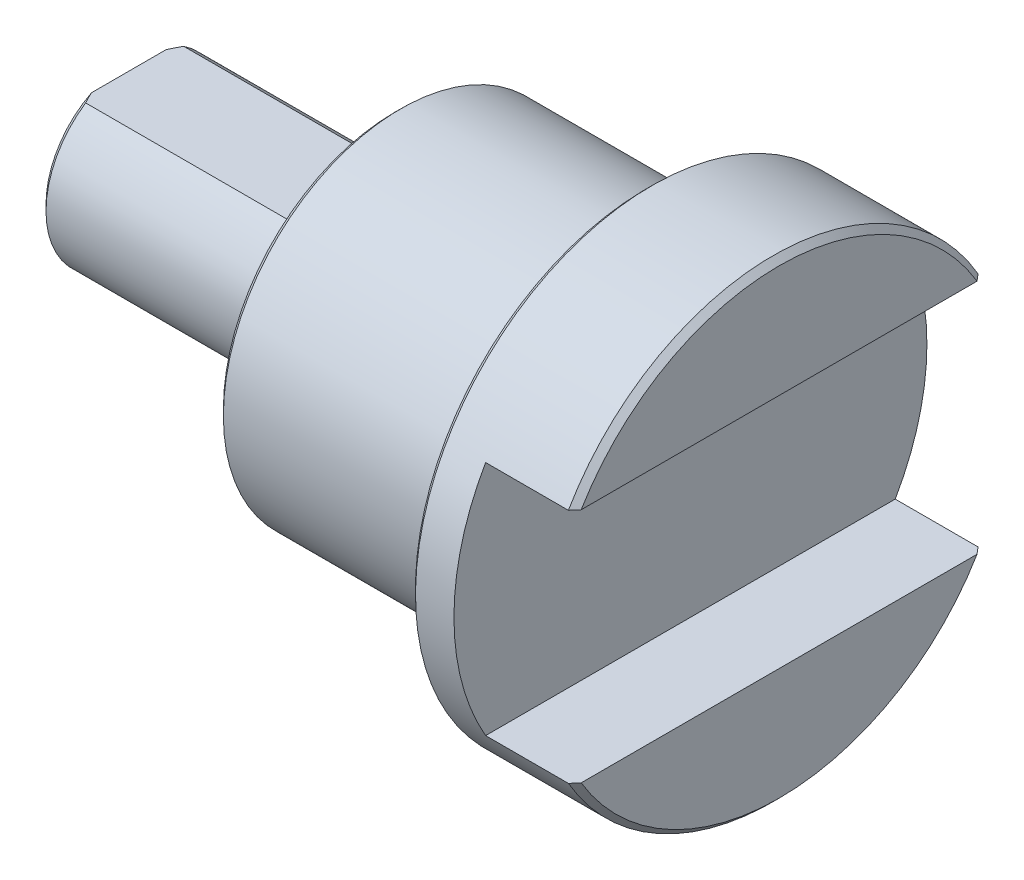
ISO-10303-21;
HEADER;
FILE_DESCRIPTION(('STEP AP214'),'2;1');
FILE_NAME('part.step','',(''),(''),'','','');
FILE_SCHEMA(('AUTOMOTIVE_DESIGN { 1 0 10303 214 1 1 1 1 }'));
ENDSEC;
DATA;
#1=APPLICATION_CONTEXT('core data for automotive mechanical design processes');
#2=APPLICATION_PROTOCOL_DEFINITION('international standard','automotive_design',2000,#1);
#3=PRODUCT_CONTEXT('',#1,'mechanical');
#4=PRODUCT('Part','Part','',(#3));
#5=PRODUCT_RELATED_PRODUCT_CATEGORY('part','',(#4));
#6=PRODUCT_DEFINITION_FORMATION('','',#4);
#7=PRODUCT_DEFINITION_CONTEXT('part definition',#1,'design');
#8=PRODUCT_DEFINITION('design','',#6,#7);
#9=PRODUCT_DEFINITION_SHAPE('','',#8);
#10=(LENGTH_UNIT() NAMED_UNIT(*) SI_UNIT(.MILLI.,.METRE.));
#11=(NAMED_UNIT(*) PLANE_ANGLE_UNIT() SI_UNIT($,.RADIAN.));
#12=(NAMED_UNIT(*) SI_UNIT($,.STERADIAN.) SOLID_ANGLE_UNIT());
#13=UNCERTAINTY_MEASURE_WITH_UNIT(LENGTH_MEASURE(1.E-05),#10,'distance_accuracy_value','');
#14=(GEOMETRIC_REPRESENTATION_CONTEXT(3) GLOBAL_UNCERTAINTY_ASSIGNED_CONTEXT((#13)) GLOBAL_UNIT_ASSIGNED_CONTEXT((#10,
#11,#12)) REPRESENTATION_CONTEXT('',''));
#15=CARTESIAN_POINT('',(0.,0.,0.));
#16=DIRECTION('',(0.,0.,1.));
#17=DIRECTION('',(1.,0.,0.));
#18=AXIS2_PLACEMENT_3D('',#15,#16,#17);
#19=CARTESIAN_POINT('',(0.,8.,0.));
#20=DIRECTION('',(-1.,0.,0.));
#21=DIRECTION('',(0.,0.,1.));
#22=AXIS2_PLACEMENT_3D('',#19,#20,#21);
#23=PLANE('',#22);
#24=CARTESIAN_POINT('',(0.,0.,0.));
#25=DIRECTION('',(-1.,0.,0.));
#26=DIRECTION('',(0.,0.,1.));
#27=AXIS2_PLACEMENT_3D('',#24,#25,#26);
#28=CIRCLE('',#27,7.80000000000001);
#29=CARTESIAN_POINT('',(0.,-4.,6.69626761711329));
#30=VERTEX_POINT('',#29);
#31=CARTESIAN_POINT('',(0.,-4.,-6.69626761711329));
#32=VERTEX_POINT('',#31);
#33=EDGE_CURVE('E122',#30,#32,#28,.F.);
#34=ORIENTED_EDGE('',*,*,#33,.T.);
#35=DIRECTION('',(0.,0.,1.));
#36=VECTOR('',#35,1.);
#37=CARTESIAN_POINT('',(0.,-4.,-10.));
#38=LINE('',#37,#36);
#39=EDGE_CURVE('E220',#32,#30,#38,.T.);
#40=ORIENTED_EDGE('',*,*,#39,.T.);
#41=EDGE_LOOP('',(#34,#40));
#42=FACE_BOUND('',#41,.T.);
#43=ADVANCED_FACE('F33',(#42),#23,.F.);
#44=CARTESIAN_POINT('',(-0.199999999999997,0.,0.));
#45=DIRECTION('',(-1.,0.,0.));
#46=DIRECTION('',(0.,0.,1.));
#47=AXIS2_PLACEMENT_3D('',#44,#45,#46);
#48=CONICAL_SURFACE('',#47,8.,0.785398163397444);
#49=CARTESIAN_POINT('',(-9.80094997070541,-4.,17.1404037254457));
#50=CARTESIAN_POINT('',(-9.38063394049411,-4.,16.7087661859987));
#51=CARTESIAN_POINT('',(-8.96071140608384,-4.,16.2767442295893));
#52=CARTESIAN_POINT('',(-8.12191951950118,-4.,15.4116505584763));
#53=CARTESIAN_POINT('',(-7.70305020399094,-4.,14.9785788082328));
#54=CARTESIAN_POINT('',(-6.86568073577781,-4.,14.1101187640156));
#55=CARTESIAN_POINT('',(-6.44718374348392,-4.,13.674727420284));
#56=CARTESIAN_POINT('',(-5.61199110002693,-4.,12.802242818545));
#57=CARTESIAN_POINT('',(-5.19529539994571,-4.,12.3651496073763));
#58=CARTESIAN_POINT('',(-4.30768049967261,-4.,11.4289633383575));
#59=CARTESIAN_POINT('',(-3.83711040364935,-4.,10.9295384624037));
#60=CARTESIAN_POINT('',(-3.13466372788852,-4.,10.1771726079081));
#61=CARTESIAN_POINT('',(-2.90107164145256,-4.,9.92583360301956));
#62=CARTESIAN_POINT('',(-2.43531596266765,-4.,9.42183617682314));
#63=CARTESIAN_POINT('',(-2.20315236442747,-4.,9.16917776096459));
#64=CARTESIAN_POINT('',(-1.74101286719653,-4.,8.66265878566752));
#65=CARTESIAN_POINT('',(-1.51103390238369,-4.,8.40880102622116));
#66=CARTESIAN_POINT('',(-1.05336574937377,-4.,7.89903189876505));
#67=CARTESIAN_POINT('',(-0.82567653341541,-4.,7.64312055572106));
#68=CARTESIAN_POINT('',(-0.373329681834949,-4.,7.12869753879525));
#69=CARTESIAN_POINT('',(-0.148671588457889,-4.,6.87018626807927));
#70=CARTESIAN_POINT('',(0.296616234963207,-4.,6.34972351406653));
#71=CARTESIAN_POINT('',(0.517246157644145,-4.,6.08777219631662));
#72=CARTESIAN_POINT('',(0.874569097823431,-4.,5.65426615453097));
#73=CARTESIAN_POINT('',(1.01291685233323,-4.,5.48407678804104));
#74=CARTESIAN_POINT('',(1.28671033842591,-4.,5.14136046744463));
#75=CARTESIAN_POINT('',(1.42215593970894,-4.,4.96883340894659));
#76=CARTESIAN_POINT('',(1.68971484425643,-4.,4.62039864938408));
#77=CARTESIAN_POINT('',(1.82181719519165,-4.,4.44448250929427));
#78=CARTESIAN_POINT('',(2.08110857825865,-4.,4.08907158392965));
#79=CARTESIAN_POINT('',(2.20829805709193,-4.,3.90957712627301));
#80=CARTESIAN_POINT('',(2.45293258993184,-4.,3.55076374570033));
#81=CARTESIAN_POINT('',(2.57054413264484,-4.,3.37155904771034));
#82=CARTESIAN_POINT('',(2.79737545838744,-4.,3.00774103386648));
#83=CARTESIAN_POINT('',(2.90659126013033,-4.,2.82312520865894));
#84=CARTESIAN_POINT('',(3.11282636758319,-4.,2.44826539490813));
#85=CARTESIAN_POINT('',(3.20990088803469,-4.,2.25805213735279));
#86=CARTESIAN_POINT('',(3.38772697065042,-4.,1.87022890703329));
#87=CARTESIAN_POINT('',(3.46850042499175,-4.,1.6726292828026));
#88=CARTESIAN_POINT('',(3.57832952845867,-4.,1.35442895535221));
#89=CARTESIAN_POINT('',(3.61484707113127,-4.,1.23640665077778));
#90=CARTESIAN_POINT('',(3.67900081631823,-4.,0.997908217565772));
#91=CARTESIAN_POINT('',(3.70663515572909,-4.,0.877431579799664));
#92=CARTESIAN_POINT('',(3.75163675748643,-4.,0.63509498959813));
#93=CARTESIAN_POINT('',(3.76904841992288,-4.,0.513243397731705));
#94=CARTESIAN_POINT('',(3.79285084239457,-4.,0.26846209094085));
#95=CARTESIAN_POINT('',(3.79924266566833,-4.,0.145532481178367));
#96=CARTESIAN_POINT('',(3.80063259536609,-4.,-0.100855367264597));
#97=CARTESIAN_POINT('',(3.79558775104063,-4.,-0.224313854967617));
#98=CARTESIAN_POINT('',(3.77431739924542,-4.,-0.470253130039276));
#99=CARTESIAN_POINT('',(3.75809127004552,-4.,-0.592733862657179));
#100=CARTESIAN_POINT('',(3.71526497366261,-4.,-0.836370440292342));
#101=CARTESIAN_POINT('',(3.68862180219781,-4.,-0.957518624603947));
#102=CARTESIAN_POINT('',(3.62622691957913,-4.,-1.19741332451113));
#103=CARTESIAN_POINT('',(3.59047437704514,-4.,-1.31615961982649));
#104=CARTESIAN_POINT('',(3.46591815411006,-4.,-1.68539774543964));
#105=CARTESIAN_POINT('',(3.36320834059842,-4.,-1.93122944287939));
#106=CARTESIAN_POINT('',(3.19143126345516,-4.,-2.29129256933534));
#107=CARTESIAN_POINT('',(3.13114463753221,-4.,-2.40999105503746));
#108=CARTESIAN_POINT('',(3.00571731269132,-4.,-2.64480683886522));
#109=CARTESIAN_POINT('',(2.94057718033892,-4.,-2.7609244362182));
#110=CARTESIAN_POINT('',(2.80589812138468,-4.,-2.99163580888893));
#111=CARTESIAN_POINT('',(2.73633185998345,-4.,-3.10621346594771));
#112=CARTESIAN_POINT('',(2.59392861160132,-4.,-3.33331679508283));
#113=CARTESIAN_POINT('',(2.52109155357013,-4.,-3.44584242250898));
#114=CARTESIAN_POINT('',(2.37279460263908,-4.,-3.66899233585089));
#115=CARTESIAN_POINT('',(2.29733725625557,-4.,-3.77961831981517));
#116=CARTESIAN_POINT('',(2.14418659429437,-4.,-3.99930127001863));
#117=CARTESIAN_POINT('',(2.06649335918749,-4.,-4.10835829251419));
#118=CARTESIAN_POINT('',(1.81616152930395,-4.,-4.45342331754723));
#119=CARTESIAN_POINT('',(1.64000722089724,-4.,-4.68688135975838));
#120=CARTESIAN_POINT('',(1.28148913820886,-4.,-5.14899453239998));
#121=CARTESIAN_POINT('',(1.09912437690402,-4.,-5.377648889959));
#122=CARTESIAN_POINT('',(0.729801007338222,-4.,-5.83138746761163));
#123=CARTESIAN_POINT('',(0.542840264535085,-4.,-6.05646994577286));
#124=CARTESIAN_POINT('',(0.16554558353955,-4.,-6.50379167777804));
#125=CARTESIAN_POINT('',(-0.0247884501998255,-4.,-6.72603085077865));
#126=CARTESIAN_POINT('',(-0.408362128147223,-4.,-7.168641419233));
#127=CARTESIAN_POINT('',(-0.601606137867261,-4.,-7.38900902497576));
#128=CARTESIAN_POINT('',(-0.990128098505704,-4.,-7.8279461912726));
#129=CARTESIAN_POINT('',(-1.18540607626287,-4.,-8.04651572803239));
#130=CARTESIAN_POINT('',(-1.77352949868664,-4.,-8.69992635185088));
#131=CARTESIAN_POINT('',(-2.16877997890403,-4.,-9.13260169239571));
#132=CARTESIAN_POINT('',(-2.96243345524239,-4.,-9.99285808990821));
#133=CARTESIAN_POINT('',(-3.36082493943383,-4.,-10.4204498088672));
#134=CARTESIAN_POINT('',(-4.16060276989072,-4.,-11.2728767991496));
#135=CARTESIAN_POINT('',(-4.56198932345884,-4.,-11.6977118757959));
#136=CARTESIAN_POINT('',(-5.3665941373838,-4.,-12.5449895743991));
#137=CARTESIAN_POINT('',(-5.76981065805904,-4.,-12.9674338504566));
#138=CARTESIAN_POINT('',(-6.57786110117972,-4.,-13.8107728998544));
#139=CARTESIAN_POINT('',(-6.98269502570556,-4.,-14.2316676712004));
#140=CARTESIAN_POINT('',(-7.58867314515406,-4.,-14.8598195535487));
#141=CARTESIAN_POINT('',(-7.78934673121689,-4.,-15.0675310557017));
#142=CARTESIAN_POINT('',(-8.19099029497038,-4.,-15.4827174979742));
#143=CARTESIAN_POINT('',(-8.39196030651169,-4.,-15.6901924053514));
#144=CARTESIAN_POINT('',(-8.79415565798748,-4.,-16.1049235723851));
#145=CARTESIAN_POINT('',(-8.99538101528301,-4.,-16.3121798152022));
#146=CARTESIAN_POINT('',(-9.39802240503638,-4.,-16.7264562961995));
#147=CARTESIAN_POINT('',(-9.59943841031262,-4.,-16.9334765607969));
#148=CARTESIAN_POINT('',(-9.80094997070541,-4.,-17.1404037254457));
#149=B_SPLINE_CURVE_WITH_KNOTS('',3,(#49,#50,#51,#52,#53,#54,#55,#56,#57,#58,#59,#60,#61,#62,
#63,#64,#65,#66,#67,#68,#69,#70,#71,#72,#73,#74,#75,#76,#77,#78,#79,#80,#81,#82,#83,#84,#85,#86,
#87,#88,#89,#90,#91,#92,#93,#94,#95,#96,#97,#98,#99,#100,#101,#102,#103,#104,#105,#106,#107,
#108,#109,#110,#111,#112,#113,#114,#115,#116,#117,#118,#119,#120,#121,#122,#123,#124,#125,#126,
#127,#128,#129,#130,#131,#132,#133,#134,#135,#136,#137,#138,#139,#140,#141,#142,#143,#144,#145,
#146,#147,#148),.UNSPECIFIED.,.F.,.F.,(4,2,2,2,2,2,2,2,2,2,2,2,2,2,2,2,2,2,2,2,2,2,2,2,2,2,2,2,
2,2,2,2,2,2,2,2,2,2,2,2,2,2,2,2,2,2,2,2,2,4),(0.,1.80742705314574,3.61491617448524,
5.4266371531854,7.23830861748603,9.29686584339698,10.3262445419346,11.3556189923662,
12.3832304593214,13.4108294523022,14.438271481746,15.4656642470333,16.1236224895919,
16.7816102112899,17.441529967967,18.101389579702,18.744277544442,19.3874685118099,
20.0276189840916,20.6669039338572,21.037248970531,21.4076716302884,21.7764733004938,
22.1452393852351,22.515392675342,22.8855665493114,23.2572850135856,23.62903741545,
24.4259934590189,24.8253445554804,25.2246491072094,25.6267184986525,26.0287966283258,
26.4304943729332,26.8321776782639,27.7093857203713,28.5867338332315,29.4644974184935,
30.3422859058824,31.2215573294501,32.1008403699766,33.8588796858606,35.6121328702958,
37.36550855246,39.1174691956599,40.8694320930653,41.7358761505322,42.6024282926308,
43.4690429001364,44.3355484510928),.UNSPECIFIED.);
#150=CARTESIAN_POINT('',(-0.200000000000085,-4.,6.92820323027568));
#151=VERTEX_POINT('',#150);
#152=EDGE_CURVE('E200',#151,#30,#149,.T.);
#153=ORIENTED_EDGE('',*,*,#152,.F.);
#154=CARTESIAN_POINT('',(-0.199999999999997,0.,0.));
#155=DIRECTION('',(-1.,0.,0.));
#156=DIRECTION('',(0.,0.,1.));
#157=AXIS2_PLACEMENT_3D('',#154,#155,#156);
#158=CIRCLE('',#157,8.);
#159=CARTESIAN_POINT('',(-0.199999999999998,-4.,-6.92820323027551));
#160=VERTEX_POINT('',#159);
#161=EDGE_CURVE('E127',#160,#151,#158,.T.);
#162=ORIENTED_EDGE('',*,*,#161,.F.);
#163=EDGE_CURVE('E112',#32,#160,#149,.T.);
#164=ORIENTED_EDGE('',*,*,#163,.F.);
#165=ORIENTED_EDGE('',*,*,#33,.F.);
#166=EDGE_LOOP('',(#153,#162,#164,#165));
#167=FACE_BOUND('',#166,.T.);
#168=ADVANCED_FACE('F187',(#167),#48,.T.);
#169=CARTESIAN_POINT('',(0.,4.,-6.69626761711329));
#170=VERTEX_POINT('',#169);
#171=CARTESIAN_POINT('',(0.,4.,6.69626761711329));
#172=VERTEX_POINT('',#171);
#173=EDGE_CURVE('E118',#170,#172,#28,.F.);
#174=ORIENTED_EDGE('',*,*,#173,.T.);
#175=DIRECTION('',(0.,0.,1.));
#176=VECTOR('',#175,1.);
#177=CARTESIAN_POINT('',(0.,4.,-10.));
#178=LINE('',#177,#176);
#179=EDGE_CURVE('E49',#170,#172,#178,.T.);
#180=ORIENTED_EDGE('',*,*,#179,.F.);
#181=EDGE_LOOP('',(#174,#180));
#182=FACE_BOUND('',#181,.T.);
#183=ADVANCED_FACE('F117',(#182),#23,.F.);
#184=CARTESIAN_POINT('',(-22.,3.,0.));
#185=DIRECTION('',(1.,0.,0.));
#186=DIRECTION('',(0.,0.,-1.));
#187=AXIS2_PLACEMENT_3D('',#184,#185,#186);
#188=PLANE('',#187);
#189=CARTESIAN_POINT('',(-22.,0.,0.));
#190=DIRECTION('',(1.,0.,0.));
#191=DIRECTION('',(0.,0.,-1.));
#192=AXIS2_PLACEMENT_3D('',#189,#190,#191);
#193=CIRCLE('',#192,2.8);
#194=CARTESIAN_POINT('',(-22.,2.5,-1.26095202129184));
#195=VERTEX_POINT('',#194);
#196=CARTESIAN_POINT('',(-22.,2.5,1.26095202129184));
#197=VERTEX_POINT('',#196);
#198=EDGE_CURVE('E139',#195,#197,#193,.F.);
#199=ORIENTED_EDGE('',*,*,#198,.T.);
#200=DIRECTION('',(0.,0.,1.));
#201=VECTOR('',#200,1.);
#202=CARTESIAN_POINT('',(-22.,2.5,-4.));
#203=LINE('',#202,#201);
#204=EDGE_CURVE('E57',#195,#197,#203,.T.);
#205=ORIENTED_EDGE('',*,*,#204,.F.);
#206=EDGE_LOOP('',(#199,#205));
#207=FACE_BOUND('',#206,.T.);
#208=ADVANCED_FACE('F180',(#207),#188,.F.);
#209=CARTESIAN_POINT('',(0.,0.,0.));
#210=DIRECTION('',(-1.,0.,0.));
#211=DIRECTION('',(0.,0.,1.));
#212=AXIS2_PLACEMENT_3D('',#209,#210,#211);
#213=CYLINDRICAL_SURFACE('',#212,3.);
#214=CARTESIAN_POINT('',(-14.,0.,0.));
#215=DIRECTION('',(-1.,0.,0.));
#216=DIRECTION('',(0.,0.,1.));
#217=AXIS2_PLACEMENT_3D('',#214,#215,#216);
#218=CIRCLE('',#217,3.);
#219=CARTESIAN_POINT('',(-14.,2.5,1.6583123951777));
#220=VERTEX_POINT('',#219);
#221=CARTESIAN_POINT('',(-14.,2.5,-1.6583123951777));
#222=VERTEX_POINT('',#221);
#223=EDGE_CURVE('E152',#220,#222,#218,.T.);
#224=ORIENTED_EDGE('',*,*,#223,.F.);
#225=DIRECTION('',(-1.,0.,0.));
#226=VECTOR('',#225,1.);
#227=CARTESIAN_POINT('',(0.,2.5,1.6583123951777));
#228=LINE('',#227,#226);
#229=CARTESIAN_POINT('',(-21.8,2.5,1.6583123951777));
#230=VERTEX_POINT('',#229);
#231=EDGE_CURVE('E241',#220,#230,#228,.T.);
#232=ORIENTED_EDGE('',*,*,#231,.T.);
#233=CARTESIAN_POINT('',(-21.8,0.,0.));
#234=DIRECTION('',(1.,0.,0.));
#235=DIRECTION('',(0.,0.,-1.));
#236=AXIS2_PLACEMENT_3D('',#233,#234,#235);
#237=CIRCLE('',#236,3.);
#238=CARTESIAN_POINT('',(-21.7999999999999,2.5,-1.65831239517971));
#239=VERTEX_POINT('',#238);
#240=EDGE_CURVE('E142',#230,#239,#237,.T.);
#241=ORIENTED_EDGE('',*,*,#240,.T.);
#242=DIRECTION('',(-1.,0.,0.));
#243=VECTOR('',#242,1.);
#244=CARTESIAN_POINT('',(0.,2.5,-1.6583123951777));
#245=LINE('',#244,#243);
#246=EDGE_CURVE('E245',#239,#222,#245,.F.);
#247=ORIENTED_EDGE('',*,*,#246,.T.);
#248=EDGE_LOOP('',(#224,#232,#241,#247));
#249=FACE_BOUND('',#248,.T.);
#250=CARTESIAN_POINT('',(-13.,0.,0.));
#251=DIRECTION('',(-1.,0.,0.));
#252=DIRECTION('',(0.,0.,1.));
#253=AXIS2_PLACEMENT_3D('',#250,#251,#252);
#254=CIRCLE('',#253,3.);
#255=CARTESIAN_POINT('',(-13.,0.,3.));
#256=VERTEX_POINT('',#255);
#257=EDGE_CURVE('E251',#256,#256,#254,.T.);
#258=ORIENTED_EDGE('',*,*,#257,.T.);
#259=EDGE_LOOP('',(#258));
#260=FACE_BOUND('',#259,.T.);
#261=ADVANCED_FACE('F176',(#249,#260),#213,.T.);
#262=CARTESIAN_POINT('',(-13.,6.,0.));
#263=DIRECTION('',(1.,0.,0.));
#264=DIRECTION('',(0.,0.,-1.));
#265=AXIS2_PLACEMENT_3D('',#262,#263,#264);
#266=PLANE('',#265);
#267=CARTESIAN_POINT('',(-13.,0.,0.));
#268=DIRECTION('',(1.,0.,0.));
#269=DIRECTION('',(0.,0.,-1.));
#270=AXIS2_PLACEMENT_3D('',#267,#268,#269);
#271=CIRCLE('',#270,5.8);
#272=CARTESIAN_POINT('',(-13.,0.,-5.8));
#273=VERTEX_POINT('',#272);
#274=EDGE_CURVE('E133',#273,#273,#271,.F.);
#275=ORIENTED_EDGE('',*,*,#274,.T.);
#276=EDGE_LOOP('',(#275));
#277=FACE_BOUND('',#276,.T.);
#278=ORIENTED_EDGE('',*,*,#257,.F.);
#279=EDGE_LOOP('',(#278));
#280=FACE_BOUND('',#279,.T.);
#281=ADVANCED_FACE('F172',(#277,#280),#266,.F.);
#282=CARTESIAN_POINT('',(0.,0.,0.));
#283=DIRECTION('',(-1.,0.,0.));
#284=DIRECTION('',(0.,0.,1.));
#285=AXIS2_PLACEMENT_3D('',#282,#283,#284);
#286=CYLINDRICAL_SURFACE('',#285,6.);
#287=CARTESIAN_POINT('',(-12.8,0.,0.));
#288=DIRECTION('',(1.,0.,0.));
#289=DIRECTION('',(0.,0.,-1.));
#290=AXIS2_PLACEMENT_3D('',#287,#288,#289);
#291=CIRCLE('',#290,6.);
#292=CARTESIAN_POINT('',(-12.8,0.,-6.));
#293=VERTEX_POINT('',#292);
#294=EDGE_CURVE('E136',#293,#293,#291,.T.);
#295=ORIENTED_EDGE('',*,*,#294,.T.);
#296=EDGE_LOOP('',(#295));
#297=FACE_BOUND('',#296,.T.);
#298=CARTESIAN_POINT('',(-4.5,0.,0.));
#299=DIRECTION('',(-1.,0.,0.));
#300=DIRECTION('',(0.,0.,1.));
#301=AXIS2_PLACEMENT_3D('',#298,#299,#300);
#302=CIRCLE('',#301,6.);
#303=CARTESIAN_POINT('',(-4.5,0.,6.));
#304=VERTEX_POINT('',#303);
#305=EDGE_CURVE('E248',#304,#304,#302,.T.);
#306=ORIENTED_EDGE('',*,*,#305,.T.);
#307=EDGE_LOOP('',(#306));
#308=FACE_BOUND('',#307,.T.);
#309=ADVANCED_FACE('F168',(#297,#308),#286,.T.);
#310=CARTESIAN_POINT('',(-4.5,6.,0.));
#311=DIRECTION('',(1.,0.,0.));
#312=DIRECTION('',(0.,0.,-1.));
#313=AXIS2_PLACEMENT_3D('',#310,#311,#312);
#314=PLANE('',#313);
#315=CARTESIAN_POINT('',(-4.5,0.,0.));
#316=DIRECTION('',(1.,0.,0.));
#317=DIRECTION('',(0.,0.,-1.));
#318=AXIS2_PLACEMENT_3D('',#315,#316,#317);
#319=CIRCLE('',#318,7.80000000000001);
#320=CARTESIAN_POINT('',(-4.5,0.,-7.80000000000001));
#321=VERTEX_POINT('',#320);
#322=EDGE_CURVE('E126',#321,#321,#319,.F.);
#323=ORIENTED_EDGE('',*,*,#322,.T.);
#324=EDGE_LOOP('',(#323));
#325=FACE_BOUND('',#324,.T.);
#326=ORIENTED_EDGE('',*,*,#305,.F.);
#327=EDGE_LOOP('',(#326));
#328=FACE_BOUND('',#327,.T.);
#329=ADVANCED_FACE('F164',(#325,#328),#314,.F.);
#330=CARTESIAN_POINT('',(0.,0.,0.));
#331=DIRECTION('',(-1.,0.,0.));
#332=DIRECTION('',(0.,0.,1.));
#333=AXIS2_PLACEMENT_3D('',#330,#331,#332);
#334=CYLINDRICAL_SURFACE('',#333,8.);
#335=CARTESIAN_POINT('',(-3.,0.,0.));
#336=DIRECTION('',(-1.,0.,0.));
#337=DIRECTION('',(0.,-1.,0.));
#338=AXIS2_PLACEMENT_3D('',#335,#336,#337);
#339=CIRCLE('',#338,8.);
#340=CARTESIAN_POINT('',(-3.,4.,-6.92820323027551));
#341=VERTEX_POINT('',#340);
#342=CARTESIAN_POINT('',(-3.,-4.,-6.92820323027551));
#343=VERTEX_POINT('',#342);
#344=EDGE_CURVE('E11',#341,#343,#339,.T.);
#345=ORIENTED_EDGE('',*,*,#344,.T.);
#346=DIRECTION('',(-1.,0.,0.));
#347=VECTOR('',#346,1.);
#348=CARTESIAN_POINT('',(0.,-4.,-6.92820323027551));
#349=LINE('',#348,#347);
#350=EDGE_CURVE('E227',#343,#160,#349,.F.);
#351=ORIENTED_EDGE('',*,*,#350,.T.);
#352=ORIENTED_EDGE('',*,*,#161,.T.);
#353=DIRECTION('',(-1.,0.,0.));
#354=VECTOR('',#353,1.);
#355=CARTESIAN_POINT('',(0.,-4.,6.92820323027551));
#356=LINE('',#355,#354);
#357=CARTESIAN_POINT('',(-3.,-4.,6.92820323027551));
#358=VERTEX_POINT('',#357);
#359=EDGE_CURVE('E231',#151,#358,#356,.T.);
#360=ORIENTED_EDGE('',*,*,#359,.T.);
#361=CARTESIAN_POINT('',(-3.,4.,6.92820323027551));
#362=VERTEX_POINT('',#361);
#363=EDGE_CURVE('E38',#358,#362,#339,.T.);
#364=ORIENTED_EDGE('',*,*,#363,.T.);
#365=DIRECTION('',(-1.,0.,0.));
#366=VECTOR('',#365,1.);
#367=CARTESIAN_POINT('',(0.,4.,6.92820323027551));
#368=LINE('',#367,#366);
#369=CARTESIAN_POINT('',(-0.199999999999998,4.,6.92820323027551));
#370=VERTEX_POINT('',#369);
#371=EDGE_CURVE('E234',#362,#370,#368,.F.);
#372=ORIENTED_EDGE('',*,*,#371,.T.);
#373=CARTESIAN_POINT('',(-0.200000000000085,4.,-6.92820323027568));
#374=VERTEX_POINT('',#373);
#375=EDGE_CURVE('E123',#370,#374,#158,.T.);
#376=ORIENTED_EDGE('',*,*,#375,.T.);
#377=DIRECTION('',(-1.,0.,0.));
#378=VECTOR('',#377,1.);
#379=CARTESIAN_POINT('',(0.,4.,-6.92820323027551));
#380=LINE('',#379,#378);
#381=EDGE_CURVE('E107',#374,#341,#380,.T.);
#382=ORIENTED_EDGE('',*,*,#381,.T.);
#383=EDGE_LOOP('',(#345,#351,#352,#360,#364,#372,#376,#382));
#384=FACE_BOUND('',#383,.T.);
#385=CARTESIAN_POINT('',(-4.30000000000001,0.,0.));
#386=DIRECTION('',(1.,0.,0.));
#387=DIRECTION('',(0.,0.,-1.));
#388=AXIS2_PLACEMENT_3D('',#385,#386,#387);
#389=CIRCLE('',#388,8.);
#390=CARTESIAN_POINT('',(-4.30000000000001,0.,-8.));
#391=VERTEX_POINT('',#390);
#392=EDGE_CURVE('E253',#391,#391,#389,.T.);
#393=ORIENTED_EDGE('',*,*,#392,.T.);
#394=EDGE_LOOP('',(#393));
#395=FACE_BOUND('',#394,.T.);
#396=ADVANCED_FACE('F161',(#384,#395),#334,.T.);
#397=CARTESIAN_POINT('',(-9.80094997070541,4.,-17.1404037254457));
#398=CARTESIAN_POINT('',(-9.38063394049411,4.,-16.7087661859987));
#399=CARTESIAN_POINT('',(-8.96071140608384,4.,-16.2767442295893));
#400=CARTESIAN_POINT('',(-8.12191951950118,4.,-15.4116505584764));
#401=CARTESIAN_POINT('',(-7.70305020399094,4.,-14.9785788082328));
#402=CARTESIAN_POINT('',(-6.86568073577781,4.,-14.1101187640156));
#403=CARTESIAN_POINT('',(-6.44718374348392,4.,-13.674727420284));
#404=CARTESIAN_POINT('',(-5.61199110002694,4.,-12.802242818545));
#405=CARTESIAN_POINT('',(-5.19529539994572,4.,-12.3651496073763));
#406=CARTESIAN_POINT('',(-4.30768049967262,4.,-11.4289633383575));
#407=CARTESIAN_POINT('',(-3.83711040364935,4.,-10.9295384624037));
#408=CARTESIAN_POINT('',(-3.13466372788852,4.,-10.1771726079081));
#409=CARTESIAN_POINT('',(-2.90107164145256,4.,-9.92583360301955));
#410=CARTESIAN_POINT('',(-2.43531596266765,4.,-9.42183617682314));
#411=CARTESIAN_POINT('',(-2.20315236442746,4.,-9.16917776096459));
#412=CARTESIAN_POINT('',(-1.74101286719652,4.,-8.66265878566751));
#413=CARTESIAN_POINT('',(-1.51103390238369,4.,-8.40880102622115));
#414=CARTESIAN_POINT('',(-1.05336574937376,4.,-7.89903189876504));
#415=CARTESIAN_POINT('',(-0.8256765334154,4.,-7.64312055572105));
#416=CARTESIAN_POINT('',(-0.373329681834937,4.,-7.12869753879523));
#417=CARTESIAN_POINT('',(-0.148671588457877,4.,-6.87018626807926));
#418=CARTESIAN_POINT('',(0.296616234963221,4.,-6.34972351406651));
#419=CARTESIAN_POINT('',(0.517246157644161,4.,-6.0877721963166));
#420=CARTESIAN_POINT('',(0.874569097823447,4.,-5.65426615453095));
#421=CARTESIAN_POINT('',(1.01291685233324,4.,-5.48407678804102));
#422=CARTESIAN_POINT('',(1.28671033842592,4.,-5.14136046744461));
#423=CARTESIAN_POINT('',(1.42215593970895,4.,-4.96883340894657));
#424=CARTESIAN_POINT('',(1.68971484425644,4.,-4.62039864938405));
#425=CARTESIAN_POINT('',(1.82181719519167,4.,-4.44448250929425));
#426=CARTESIAN_POINT('',(2.08110857825867,4.,-4.08907158392962));
#427=CARTESIAN_POINT('',(2.20829805709195,4.,-3.90957712627298));
#428=CARTESIAN_POINT('',(2.45293258993186,4.,-3.5507637457003));
#429=CARTESIAN_POINT('',(2.57054413264486,4.,-3.37155904771031));
#430=CARTESIAN_POINT('',(2.79737545838745,4.,-3.00774103386645));
#431=CARTESIAN_POINT('',(2.90659126013035,4.,-2.82312520865891));
#432=CARTESIAN_POINT('',(3.11282636758321,4.,-2.4482653949081));
#433=CARTESIAN_POINT('',(3.2099008880347,4.,-2.25805213735276));
#434=CARTESIAN_POINT('',(3.38772697065043,4.,-1.87022890703326));
#435=CARTESIAN_POINT('',(3.46850042499177,4.,-1.67262928280256));
#436=CARTESIAN_POINT('',(3.57832952845869,4.,-1.35442895535217));
#437=CARTESIAN_POINT('',(3.61484707113128,4.,-1.23640665077775));
#438=CARTESIAN_POINT('',(3.67900081631824,4.,-0.997908217565735));
#439=CARTESIAN_POINT('',(3.7066351557291,4.,-0.877431579799627));
#440=CARTESIAN_POINT('',(3.75163675748643,4.,-0.635094989598093));
#441=CARTESIAN_POINT('',(3.76904841992288,4.,-0.513243397731669));
#442=CARTESIAN_POINT('',(3.79285084239457,4.,-0.268462090940817));
#443=CARTESIAN_POINT('',(3.79924266566833,4.,-0.145532481178334));
#444=CARTESIAN_POINT('',(3.80063259536609,4.,0.100855367264627));
#445=CARTESIAN_POINT('',(3.79558775104063,4.,0.224313854967645));
#446=CARTESIAN_POINT('',(3.77431739924541,4.,0.470253130039303));
#447=CARTESIAN_POINT('',(3.75809127004551,4.,0.592733862657204));
#448=CARTESIAN_POINT('',(3.7152649736626,4.,0.836370440292365));
#449=CARTESIAN_POINT('',(3.68862180219781,4.,0.95751862460397));
#450=CARTESIAN_POINT('',(3.62622691957912,4.,1.19741332451115));
#451=CARTESIAN_POINT('',(3.59047437704513,4.,1.31615961982652));
#452=CARTESIAN_POINT('',(3.46591815411005,4.,1.68539774543967));
#453=CARTESIAN_POINT('',(3.36320834059841,4.,1.93122944287942));
#454=CARTESIAN_POINT('',(3.19143126345515,4.,2.29129256933538));
#455=CARTESIAN_POINT('',(3.13114463753219,4.,2.4099910550375));
#456=CARTESIAN_POINT('',(3.00571731269129,4.,2.64480683886527));
#457=CARTESIAN_POINT('',(2.9405771803389,4.,2.76092443621825));
#458=CARTESIAN_POINT('',(2.80589812138465,4.,2.99163580888898));
#459=CARTESIAN_POINT('',(2.73633185998342,4.,3.10621346594775));
#460=CARTESIAN_POINT('',(2.59392861160129,4.,3.33331679508288));
#461=CARTESIAN_POINT('',(2.5210915535701,4.,3.44584242250903));
#462=CARTESIAN_POINT('',(2.37279460263905,4.,3.66899233585094));
#463=CARTESIAN_POINT('',(2.29733725625554,4.,3.77961831981522));
#464=CARTESIAN_POINT('',(2.14418659429433,4.,3.99930127001868));
#465=CARTESIAN_POINT('',(2.06649335918745,4.,4.10835829251424));
#466=CARTESIAN_POINT('',(1.8161615293039,4.,4.45342331754729));
#467=CARTESIAN_POINT('',(1.64000722089719,4.,4.68688135975845));
#468=CARTESIAN_POINT('',(1.2814891382088,4.,5.14899453240006));
#469=CARTESIAN_POINT('',(1.09912437690395,4.,5.37764888995908));
#470=CARTESIAN_POINT('',(0.729801007338151,4.,5.83138746761172));
#471=CARTESIAN_POINT('',(0.542840264535012,4.,6.05646994577295));
#472=CARTESIAN_POINT('',(0.165545583539469,4.,6.50379167777814));
#473=CARTESIAN_POINT('',(-0.0247884501999124,4.,6.72603085077875));
#474=CARTESIAN_POINT('',(-0.408362128147318,4.,7.16864141923311));
#475=CARTESIAN_POINT('',(-0.601606137867357,4.,7.38900902497587));
#476=CARTESIAN_POINT('',(-0.990128098505808,4.,7.82794619127271));
#477=CARTESIAN_POINT('',(-1.18540607626298,4.,8.04651572803251));
#478=CARTESIAN_POINT('',(-1.77352949868676,4.,8.69992635185101));
#479=CARTESIAN_POINT('',(-2.16877997890415,4.,9.13260169239585));
#480=CARTESIAN_POINT('',(-2.96243345524254,4.,9.99285808990836));
#481=CARTESIAN_POINT('',(-3.36082493943398,4.,10.4204498088673));
#482=CARTESIAN_POINT('',(-4.16060276989089,4.,11.2728767991498));
#483=CARTESIAN_POINT('',(-4.56198932345902,4.,11.6977118757961));
#484=CARTESIAN_POINT('',(-5.36659413738399,4.,12.5449895743993));
#485=CARTESIAN_POINT('',(-5.76981065805925,4.,12.9674338504568));
#486=CARTESIAN_POINT('',(-6.57786110117994,4.,13.8107728998547));
#487=CARTESIAN_POINT('',(-6.98269502570578,4.,14.2316676712007));
#488=CARTESIAN_POINT('',(-7.58867314515427,4.,14.8598195535489));
#489=CARTESIAN_POINT('',(-7.78934673121708,4.,15.0675310557019));
#490=CARTESIAN_POINT('',(-8.19099029497053,4.,15.4827174979743));
#491=CARTESIAN_POINT('',(-8.39196030651182,4.,15.6901924053516));
#492=CARTESIAN_POINT('',(-8.79415565798757,4.,16.1049235723852));
#493=CARTESIAN_POINT('',(-8.99538101528308,4.,16.3121798152023));
#494=CARTESIAN_POINT('',(-9.39802240503641,4.,16.7264562961996));
#495=CARTESIAN_POINT('',(-9.59943841031263,4.,16.933476560797));
#496=CARTESIAN_POINT('',(-9.80094997070541,4.,17.1404037254457));
#497=B_SPLINE_CURVE_WITH_KNOTS('',3,(#397,#398,#399,#400,#401,#402,#403,#404,#405,#406,#407,
#408,#409,#410,#411,#412,#413,#414,#415,#416,#417,#418,#419,#420,#421,#422,#423,#424,#425,#426,
#427,#428,#429,#430,#431,#432,#433,#434,#435,#436,#437,#438,#439,#440,#441,#442,#443,#444,#445,
#446,#447,#448,#449,#450,#451,#452,#453,#454,#455,#456,#457,#458,#459,#460,#461,#462,#463,#464,
#465,#466,#467,#468,#469,#470,#471,#472,#473,#474,#475,#476,#477,#478,#479,#480,#481,#482,#483,
#484,#485,#486,#487,#488,#489,#490,#491,#492,#493,#494,#495,#496),.UNSPECIFIED.,.F.,.F.,(4,2,2,
2,2,2,2,2,2,2,2,2,2,2,2,2,2,2,2,2,2,2,2,2,2,2,2,2,2,2,2,2,2,2,2,2,2,2,2,2,2,2,2,2,2,2,2,2,2,4),
(0.,1.80742705314574,3.61491617448523,5.42663715318539,7.23830861748601,9.29686584339698,
10.3262445419346,11.3556189923662,12.3832304593214,13.4108294523022,14.438271481746,
15.4656642470333,16.1236224895919,16.78161021129,17.4415299679671,18.101389579702,
18.7442775444421,19.38746851181,20.0276189840917,20.6669039338572,21.037248970531,
21.4076716302885,21.7764733004938,22.1452393852352,22.515392675342,22.8855665493114,
23.2572850135856,23.62903741545,24.4259934590189,24.8253445554804,25.2246491072095,
25.6267184986526,26.0287966283259,26.4304943729333,26.832177678264,27.7093857203714,
28.5867338332316,29.4644974184937,30.3422859058826,31.2215573294503,32.1008403699768,
33.8588796858608,35.6121328702961,37.3655085524602,39.1174691956602,40.8694320930657,
41.7358761505324,42.602428292631,43.4690429001365,44.3355484510929),.UNSPECIFIED.);
#498=EDGE_CURVE('E103',#374,#170,#497,.T.);
#499=ORIENTED_EDGE('',*,*,#498,.F.);
#500=ORIENTED_EDGE('',*,*,#375,.F.);
#501=EDGE_CURVE('E113',#172,#370,#497,.T.);
#502=ORIENTED_EDGE('',*,*,#501,.F.);
#503=ORIENTED_EDGE('',*,*,#173,.F.);
#504=EDGE_LOOP('',(#499,#500,#502,#503));
#505=FACE_BOUND('',#504,.T.);
#506=ADVANCED_FACE('F121',(#505),#48,.T.);
#507=CARTESIAN_POINT('',(-4.5,0.,0.));
#508=DIRECTION('',(1.,0.,0.));
#509=DIRECTION('',(0.,0.,-1.));
#510=AXIS2_PLACEMENT_3D('',#507,#508,#509);
#511=CONICAL_SURFACE('',#510,7.80000000000001,0.785398163397457);
#512=CARTESIAN_POINT('',(-4.30000000000001,0.,-8.));
#513=CARTESIAN_POINT('',(-4.30208333333335,0.,-7.99791666666667));
#514=CARTESIAN_POINT('',(-4.30416666666668,0.,-7.99583333333333));
#515=CARTESIAN_POINT('',(-4.30833333333334,0.,-7.99166666666667));
#516=CARTESIAN_POINT('',(-4.31041666666668,0.,-7.98958333333333));
#517=CARTESIAN_POINT('',(-4.31458333333334,0.,-7.98541666666667));
#518=CARTESIAN_POINT('',(-4.31666666666668,0.,-7.98333333333333));
#519=CARTESIAN_POINT('',(-4.32083333333334,0.,-7.97916666666667));
#520=CARTESIAN_POINT('',(-4.32291666666668,0.,-7.97708333333333));
#521=CARTESIAN_POINT('',(-4.32708333333334,0.,-7.97291666666667));
#522=CARTESIAN_POINT('',(-4.32916666666668,0.,-7.97083333333333));
#523=CARTESIAN_POINT('',(-4.33333333333334,0.,-7.96666666666667));
#524=CARTESIAN_POINT('',(-4.33541666666668,0.,-7.96458333333333));
#525=CARTESIAN_POINT('',(-4.33958333333334,0.,-7.96041666666667));
#526=CARTESIAN_POINT('',(-4.34166666666668,0.,-7.95833333333333));
#527=CARTESIAN_POINT('',(-4.34583333333334,0.,-7.95416666666667));
#528=CARTESIAN_POINT('',(-4.34791666666668,0.,-7.95208333333334));
#529=CARTESIAN_POINT('',(-4.35208333333334,0.,-7.94791666666667));
#530=CARTESIAN_POINT('',(-4.35416666666668,0.,-7.94583333333334));
#531=CARTESIAN_POINT('',(-4.35833333333334,0.,-7.94166666666667));
#532=CARTESIAN_POINT('',(-4.36041666666667,0.,-7.93958333333333));
#533=CARTESIAN_POINT('',(-4.36458333333334,0.,-7.93541666666667));
#534=CARTESIAN_POINT('',(-4.36666666666668,0.,-7.93333333333334));
#535=CARTESIAN_POINT('',(-4.37083333333334,0.,-7.92916666666667));
#536=CARTESIAN_POINT('',(-4.37291666666667,0.,-7.92708333333334));
#537=CARTESIAN_POINT('',(-4.37708333333334,0.,-7.92291666666667));
#538=CARTESIAN_POINT('',(-4.37916666666667,0.,-7.92083333333334));
#539=CARTESIAN_POINT('',(-4.38333333333334,0.,-7.91666666666667));
#540=CARTESIAN_POINT('',(-4.38541666666667,0.,-7.91458333333334));
#541=CARTESIAN_POINT('',(-4.38958333333334,0.,-7.91041666666667));
#542=CARTESIAN_POINT('',(-4.39166666666667,0.,-7.90833333333334));
#543=CARTESIAN_POINT('',(-4.39583333333334,0.,-7.90416666666667));
#544=CARTESIAN_POINT('',(-4.39791666666667,0.,-7.90208333333334));
#545=CARTESIAN_POINT('',(-4.40208333333334,0.,-7.89791666666667));
#546=CARTESIAN_POINT('',(-4.40416666666667,0.,-7.89583333333334));
#547=CARTESIAN_POINT('',(-4.40833333333334,0.,-7.89166666666667));
#548=CARTESIAN_POINT('',(-4.41041666666667,0.,-7.88958333333334));
#549=CARTESIAN_POINT('',(-4.41458333333334,0.,-7.88541666666667));
#550=CARTESIAN_POINT('',(-4.41666666666667,0.,-7.88333333333334));
#551=CARTESIAN_POINT('',(-4.42083333333334,0.,-7.87916666666667));
#552=CARTESIAN_POINT('',(-4.42291666666667,0.,-7.87708333333334));
#553=CARTESIAN_POINT('',(-4.42708333333334,0.,-7.87291666666667));
#554=CARTESIAN_POINT('',(-4.42916666666667,0.,-7.87083333333334));
#555=CARTESIAN_POINT('',(-4.43333333333334,0.,-7.86666666666667));
#556=CARTESIAN_POINT('',(-4.43541666666667,0.,-7.86458333333334));
#557=CARTESIAN_POINT('',(-4.43958333333334,0.,-7.86041666666667));
#558=CARTESIAN_POINT('',(-4.44166666666667,0.,-7.85833333333334));
#559=CARTESIAN_POINT('',(-4.44583333333334,0.,-7.85416666666667));
#560=CARTESIAN_POINT('',(-4.44791666666667,0.,-7.85208333333334));
#561=CARTESIAN_POINT('',(-4.45208333333334,0.,-7.84791666666667));
#562=CARTESIAN_POINT('',(-4.45416666666667,0.,-7.84583333333334));
#563=CARTESIAN_POINT('',(-4.45833333333334,0.,-7.84166666666667));
#564=CARTESIAN_POINT('',(-4.46041666666667,0.,-7.83958333333334));
#565=CARTESIAN_POINT('',(-4.46458333333334,0.,-7.83541666666667));
#566=CARTESIAN_POINT('',(-4.46666666666667,0.,-7.83333333333334));
#567=CARTESIAN_POINT('',(-4.47083333333333,0.,-7.82916666666667));
#568=CARTESIAN_POINT('',(-4.47291666666667,0.,-7.82708333333334));
#569=CARTESIAN_POINT('',(-4.47708333333333,0.,-7.82291666666667));
#570=CARTESIAN_POINT('',(-4.47916666666667,0.,-7.82083333333334));
#571=CARTESIAN_POINT('',(-4.48333333333333,0.,-7.81666666666667));
#572=CARTESIAN_POINT('',(-4.48541666666667,0.,-7.81458333333334));
#573=CARTESIAN_POINT('',(-4.48958333333333,0.,-7.81041666666667));
#574=CARTESIAN_POINT('',(-4.49166666666667,0.,-7.80833333333334));
#575=CARTESIAN_POINT('',(-4.49583333333333,0.,-7.80416666666667));
#576=CARTESIAN_POINT('',(-4.49791666666667,0.,-7.80208333333334));
#577=CARTESIAN_POINT('',(-4.5,0.,-7.80000000000001));
#578=B_SPLINE_CURVE_WITH_KNOTS('',3,(#512,#513,#514,#515,#516,#517,#518,#519,#520,#521,#522,
#523,#524,#525,#526,#527,#528,#529,#530,#531,#532,#533,#534,#535,#536,#537,#538,#539,#540,#541,
#542,#543,#544,#545,#546,#547,#548,#549,#550,#551,#552,#553,#554,#555,#556,#557,#558,#559,#560,
#561,#562,#563,#564,#565,#566,#567,#568,#569,#570,#571,#572,#573,#574,#575,#576,#577),
.UNSPECIFIED.,.F.,.F.,(4,2,2,2,2,2,2,2,2,2,2,2,2,2,2,2,2,2,2,2,2,2,2,2,2,2,2,2,2,2,2,2,4),(0.,
0.00883883476483148,0.0176776695296636,0.0265165042944951,0.0353553390593259,0.0441941738241568,
0.0530330085889895,0.0618718433538204,0.0707106781186512,0.0795495128834827,0.0883883476483148,
0.0972271824131463,0.106066017177977,0.114904851942808,0.123743686707641,0.132582521472472,
0.141421356237302,0.150260191002134,0.159099025766966,0.167937860531798,0.176776695296628,
0.185615530061459,0.194454364826292,0.203293199591123,0.212132034355954,0.220970869120785,
0.229809703885617,0.238648538650449,0.24748737341528,0.256326208180112,0.265165042944943,
0.274003877709774,0.282842712474606),.UNSPECIFIED.);
#579=EDGE_CURVE('BSEAM191',#391,#321,#578,.T.);
#580=ORIENTED_EDGE('',*,*,#392,.F.);
#581=ORIENTED_EDGE('',*,*,#322,.F.);
#582=ORIENTED_EDGE('',*,*,#579,.T.);
#583=ORIENTED_EDGE('',*,*,#579,.F.);
#584=EDGE_LOOP('',(#580,#582,#581,#583));
#585=FACE_BOUND('',#584,.T.);
#586=ADVANCED_FACE('F191',(#585),#511,.T.);
#587=CARTESIAN_POINT('',(-13.,0.,0.));
#588=DIRECTION('',(1.,0.,0.));
#589=DIRECTION('',(0.,0.,-1.));
#590=AXIS2_PLACEMENT_3D('',#587,#588,#589);
#591=CONICAL_SURFACE('',#590,5.8,0.785398163397444);
#592=ORIENTED_EDGE('',*,*,#294,.F.);
#593=EDGE_LOOP('',(#592));
#594=FACE_BOUND('',#593,.T.);
#595=ORIENTED_EDGE('',*,*,#274,.F.);
#596=EDGE_LOOP('',(#595));
#597=FACE_BOUND('',#596,.T.);
#598=ADVANCED_FACE('F259',(#594,#597),#591,.T.);
#599=CARTESIAN_POINT('',(-22.,0.,0.));
#600=DIRECTION('',(1.,0.,0.));
#601=DIRECTION('',(0.,0.,-1.));
#602=AXIS2_PLACEMENT_3D('',#599,#600,#601);
#603=CONICAL_SURFACE('',#602,2.8,0.78539816339744);
#604=CARTESIAN_POINT('',(-18.1978005552471,2.5,-6.11056769116375));
#605=CARTESIAN_POINT('',(-18.3674228671585,2.5,-5.92724450767903));
#606=CARTESIAN_POINT('',(-18.536510046766,2.5,-5.74341871192806));
#607=CARTESIAN_POINT('',(-18.8731689280435,2.5,-5.37431157681408));
#608=CARTESIAN_POINT('',(-19.0407402875592,2.5,-5.18902992563998));
#609=CARTESIAN_POINT('',(-19.374836222167,2.5,-4.81553546661451));
#610=CARTESIAN_POINT('',(-19.5413486712304,2.5,-4.62731178615205));
#611=CARTESIAN_POINT('',(-19.8714991266615,2.5,-4.24838931301077));
#612=CARTESIAN_POINT('',(-20.0351374678248,2.5,-4.05769081317643));
#613=CARTESIAN_POINT('',(-20.3261521488407,2.5,-3.71110630283353));
#614=CARTESIAN_POINT('',(-20.4542661824059,2.5,-3.55584189980935));
#615=CARTESIAN_POINT('',(-20.7068484148511,2.5,-3.24230393926299));
#616=CARTESIAN_POINT('',(-20.8313157330456,2.5,-3.08402966982806));
#617=CARTESIAN_POINT('',(-21.0748569226115,2.5,-2.76361764071656));
#618=CARTESIAN_POINT('',(-21.1939367621535,2.5,-2.60148447573723));
#619=CARTESIAN_POINT('',(-21.3665592361804,2.5,-2.35413710848057));
#620=CARTESIAN_POINT('',(-21.4230910905903,2.5,-2.271011711699));
#621=CARTESIAN_POINT('',(-21.5336443034709,2.5,-2.10311272897225));
#622=CARTESIAN_POINT('',(-21.5876659419831,2.5,-2.01833932838335));
#623=CARTESIAN_POINT('',(-21.6913585193737,2.5,-1.84879581247391));
#624=CARTESIAN_POINT('',(-21.7411003821078,2.5,-1.76406930502599));
#625=CARTESIAN_POINT('',(-21.8367378723564,2.5,-1.59248131876098));
#626=CARTESIAN_POINT('',(-21.8826343850947,2.5,-1.50562033730085));
#627=CARTESIAN_POINT('',(-21.9695038533714,2.5,-1.32950132337102));
#628=CARTESIAN_POINT('',(-22.0104792177964,2.5,-1.24024449005827));
#629=CARTESIAN_POINT('',(-22.0861607917844,2.5,-1.05909697857509));
#630=CARTESIAN_POINT('',(-22.1208687835966,2.5,-0.967207057813947));
#631=CARTESIAN_POINT('',(-22.1756442663159,2.5,-0.801223752070317));
#632=CARTESIAN_POINT('',(-22.1972533474268,2.5,-0.727642027126277));
#633=CARTESIAN_POINT('',(-22.2348201417228,2.5,-0.579057795233781));
#634=CARTESIAN_POINT('',(-22.2507799482705,2.5,-0.504055825439374));
#635=CARTESIAN_POINT('',(-22.2762649022687,2.5,-0.353192114601792));
#636=CARTESIAN_POINT('',(-22.2858100187608,2.5,-0.277333796264467));
#637=CARTESIAN_POINT('',(-22.2980239997115,2.5,-0.12506048138577));
#638=CARTESIAN_POINT('',(-22.3006932460911,2.5,-0.0486455159998735));
#639=CARTESIAN_POINT('',(-22.2989969987656,2.5,0.104302393604252));
#640=CARTESIAN_POINT('',(-22.2946133385462,2.5,0.180835133593898));
#641=CARTESIAN_POINT('',(-22.2790330985181,2.5,0.333198075744762));
#642=CARTESIAN_POINT('',(-22.2678359740788,2.5,0.409028221252485));
#643=CARTESIAN_POINT('',(-22.239180438119,2.5,0.559724540594273));
#644=CARTESIAN_POINT('',(-22.221702631115,2.5,0.634586975808015));
#645=CARTESIAN_POINT('',(-22.181280252182,2.5,0.782800378462762));
#646=CARTESIAN_POINT('',(-22.1583354513797,2.5,0.856151282484475));
#647=CARTESIAN_POINT('',(-22.0765001820347,2.5,1.09119363498811));
#648=CARTESIAN_POINT('',(-22.008315604747,2.5,1.24964928819905));
#649=CARTESIAN_POINT('',(-21.8567560059498,2.5,1.55915898283444));
#650=CARTESIAN_POINT('',(-21.7733499236889,2.5,1.71019707329689));
#651=CARTESIAN_POINT('',(-21.5955761391667,2.5,2.00817401095542));
#652=CARTESIAN_POINT('',(-21.5010840967209,2.5,2.1550377051408));
#653=CARTESIAN_POINT('',(-21.3054495518431,2.5,2.44400405680685));
#654=CARTESIAN_POINT('',(-21.2043132543775,2.5,2.58611097445583));
#655=CARTESIAN_POINT('',(-20.9874400587062,2.5,2.8803504763645));
#656=CARTESIAN_POINT('',(-20.8712338290801,2.5,3.03213495744881));
#657=CARTESIAN_POINT('',(-20.6349161305295,2.5,3.33264378824983));
#658=CARTESIAN_POINT('',(-20.5148041594418,2.5,3.48136774042698));
#659=CARTESIAN_POINT('',(-20.271661169823,2.5,3.77662050562517));
#660=CARTESIAN_POINT('',(-20.148627689695,2.5,3.92314728458442));
#661=CARTESIAN_POINT('',(-19.9004616155639,2.5,4.21441347401978));
#662=CARTESIAN_POINT('',(-19.7753289717112,2.5,4.35915284190744));
#663=CARTESIAN_POINT('',(-19.5304831451929,2.5,4.63919812581845));
#664=CARTESIAN_POINT('',(-19.4108567681594,2.5,4.77458008166062));
#665=CARTESIAN_POINT('',(-19.1704707749338,2.5,5.04433751209648));
#666=CARTESIAN_POINT('',(-19.0497111378519,2.5,5.17871296805451));
#667=CARTESIAN_POINT('',(-18.8075113040678,2.5,5.44639054960814));
#668=CARTESIAN_POINT('',(-18.6860728068242,2.5,5.57969421471341));
#669=CARTESIAN_POINT('',(-18.4424544533831,2.5,5.84561244660794));
#670=CARTESIAN_POINT('',(-18.320274628236,2.5,5.97822704183276));
#671=CARTESIAN_POINT('',(-18.1978005552471,2.5,6.11056769116375));
#672=B_SPLINE_CURVE_WITH_KNOTS('',3,(#604,#605,#606,#607,#608,#609,#610,#611,#612,#613,#614,
#615,#616,#617,#618,#619,#620,#621,#622,#623,#624,#625,#626,#627,#628,#629,#630,#631,#632,#633,
#634,#635,#636,#637,#638,#639,#640,#641,#642,#643,#644,#645,#646,#647,#648,#649,#650,#651,#652,
#653,#654,#655,#656,#657,#658,#659,#660,#661,#662,#663,#664,#665,#666,#667,#668,#669,#670,#671),
.UNSPECIFIED.,.F.,.F.,(4,2,2,2,2,2,2,2,2,2,2,2,2,2,2,2,2,2,2,2,2,2,2,2,2,2,2,2,2,2,2,2,2,4),(0.,
0.749281616354833,1.49872834103739,2.2526256956455,3.00643464084014,3.61028255987414,
4.21427512645973,4.81758134009797,5.11912831539779,5.42064156875071,5.71531050554809,
6.0099114202446,6.30436753584007,6.59873978478712,6.82861870521078,7.05841235363304,
7.28748729513619,7.51654951237027,7.74620268143785,7.97587421011932,8.20626117386253,
8.43665778434717,8.95273072870931,9.46986878350027,9.99349158681114,10.5166321534244,
11.0900217803148,11.6634854219717,12.2374507154511,12.811429658455,13.3534078954223,
13.8953961425981,14.4363687052104,14.9773187635558),.UNSPECIFIED.);
#673=EDGE_CURVE('E151',#239,#195,#672,.T.);
#674=ORIENTED_EDGE('',*,*,#673,.F.);
#675=ORIENTED_EDGE('',*,*,#240,.F.);
#676=EDGE_CURVE('E145',#197,#230,#672,.T.);
#677=ORIENTED_EDGE('',*,*,#676,.F.);
#678=ORIENTED_EDGE('',*,*,#198,.F.);
#679=EDGE_LOOP('',(#674,#675,#677,#678));
#680=FACE_BOUND('',#679,.T.);
#681=ADVANCED_FACE('F35',(#680),#603,.T.);
#682=CARTESIAN_POINT('',(-14.,0.,0.));
#683=DIRECTION('',(-1.,0.,0.));
#684=DIRECTION('',(0.,0.,1.));
#685=AXIS2_PLACEMENT_3D('',#682,#683,#684);
#686=PLANE('',#685);
#687=ORIENTED_EDGE('',*,*,#223,.T.);
#688=DIRECTION('',(0.,0.,1.));
#689=VECTOR('',#688,1.);
#690=CARTESIAN_POINT('',(-14.,2.5,-4.));
#691=LINE('',#690,#689);
#692=EDGE_CURVE('E238',#222,#220,#691,.T.);
#693=ORIENTED_EDGE('',*,*,#692,.T.);
#694=EDGE_LOOP('',(#687,#693));
#695=FACE_BOUND('',#694,.T.);
#696=ADVANCED_FACE('F159',(#695),#686,.T.);
#697=CARTESIAN_POINT('',(-14.,2.5,-4.));
#698=DIRECTION('',(0.,-1.,0.));
#699=DIRECTION('',(0.,0.,-1.));
#700=AXIS2_PLACEMENT_3D('',#697,#698,#699);
#701=PLANE('',#700);
#702=ORIENTED_EDGE('',*,*,#673,.T.);
#703=ORIENTED_EDGE('',*,*,#204,.T.);
#704=ORIENTED_EDGE('',*,*,#676,.T.);
#705=ORIENTED_EDGE('',*,*,#231,.F.);
#706=ORIENTED_EDGE('',*,*,#692,.F.);
#707=ORIENTED_EDGE('',*,*,#246,.F.);
#708=EDGE_LOOP('',(#702,#703,#704,#705,#706,#707));
#709=FACE_BOUND('',#708,.T.);
#710=ADVANCED_FACE('F153',(#709),#701,.F.);
#711=CARTESIAN_POINT('',(-3.,4.,-10.));
#712=DIRECTION('',(-1.,0.,0.));
#713=DIRECTION('',(0.,-1.,0.));
#714=AXIS2_PLACEMENT_3D('',#711,#712,#713);
#715=PLANE('',#714);
#716=DIRECTION('',(0.,0.,1.));
#717=VECTOR('',#716,1.);
#718=CARTESIAN_POINT('',(-3.,-4.,-10.));
#719=LINE('',#718,#717);
#720=EDGE_CURVE('E290',#343,#358,#719,.T.);
#721=ORIENTED_EDGE('',*,*,#720,.F.);
#722=ORIENTED_EDGE('',*,*,#344,.F.);
#723=DIRECTION('',(0.,0.,1.));
#724=VECTOR('',#723,1.);
#725=CARTESIAN_POINT('',(-3.,4.,-10.));
#726=LINE('',#725,#724);
#727=EDGE_CURVE('E119',#341,#362,#726,.T.);
#728=ORIENTED_EDGE('',*,*,#727,.T.);
#729=ORIENTED_EDGE('',*,*,#363,.F.);
#730=EDGE_LOOP('',(#721,#722,#728,#729));
#731=FACE_BOUND('',#730,.T.);
#732=ADVANCED_FACE('F158',(#731),#715,.F.);
#733=CARTESIAN_POINT('',(0.,-4.,-10.));
#734=DIRECTION('',(0.,-1.,0.));
#735=DIRECTION('',(0.,0.,-1.));
#736=AXIS2_PLACEMENT_3D('',#733,#734,#735);
#737=PLANE('',#736);
#738=ORIENTED_EDGE('',*,*,#152,.T.);
#739=ORIENTED_EDGE('',*,*,#39,.F.);
#740=ORIENTED_EDGE('',*,*,#163,.T.);
#741=ORIENTED_EDGE('',*,*,#350,.F.);
#742=ORIENTED_EDGE('',*,*,#720,.T.);
#743=ORIENTED_EDGE('',*,*,#359,.F.);
#744=EDGE_LOOP('',(#738,#739,#740,#741,#742,#743));
#745=FACE_BOUND('',#744,.T.);
#746=ADVANCED_FACE('F201',(#745),#737,.F.);
#747=CARTESIAN_POINT('',(0.,4.,-10.));
#748=DIRECTION('',(0.,1.,0.));
#749=DIRECTION('',(0.,0.,1.));
#750=AXIS2_PLACEMENT_3D('',#747,#748,#749);
#751=PLANE('',#750);
#752=ORIENTED_EDGE('',*,*,#498,.T.);
#753=ORIENTED_EDGE('',*,*,#179,.T.);
#754=ORIENTED_EDGE('',*,*,#501,.T.);
#755=ORIENTED_EDGE('',*,*,#371,.F.);
#756=ORIENTED_EDGE('',*,*,#727,.F.);
#757=ORIENTED_EDGE('',*,*,#381,.F.);
#758=EDGE_LOOP('',(#752,#753,#754,#755,#756,#757));
#759=FACE_BOUND('',#758,.T.);
#760=ADVANCED_FACE('F104',(#759),#751,.F.);
#761=CLOSED_SHELL('',(#43,#168,#183,#208,#261,#281,#309,#329,#396,#506,#586,#598,#681,#696,#710,
#732,#746,#760));
#762=MANIFOLD_SOLID_BREP('B2',#761);
#763=ADVANCED_BREP_SHAPE_REPRESENTATION('',(#18,#762),#14);
#764=SHAPE_DEFINITION_REPRESENTATION(#9,#763);
ENDSEC;
END-ISO-10303-21;
